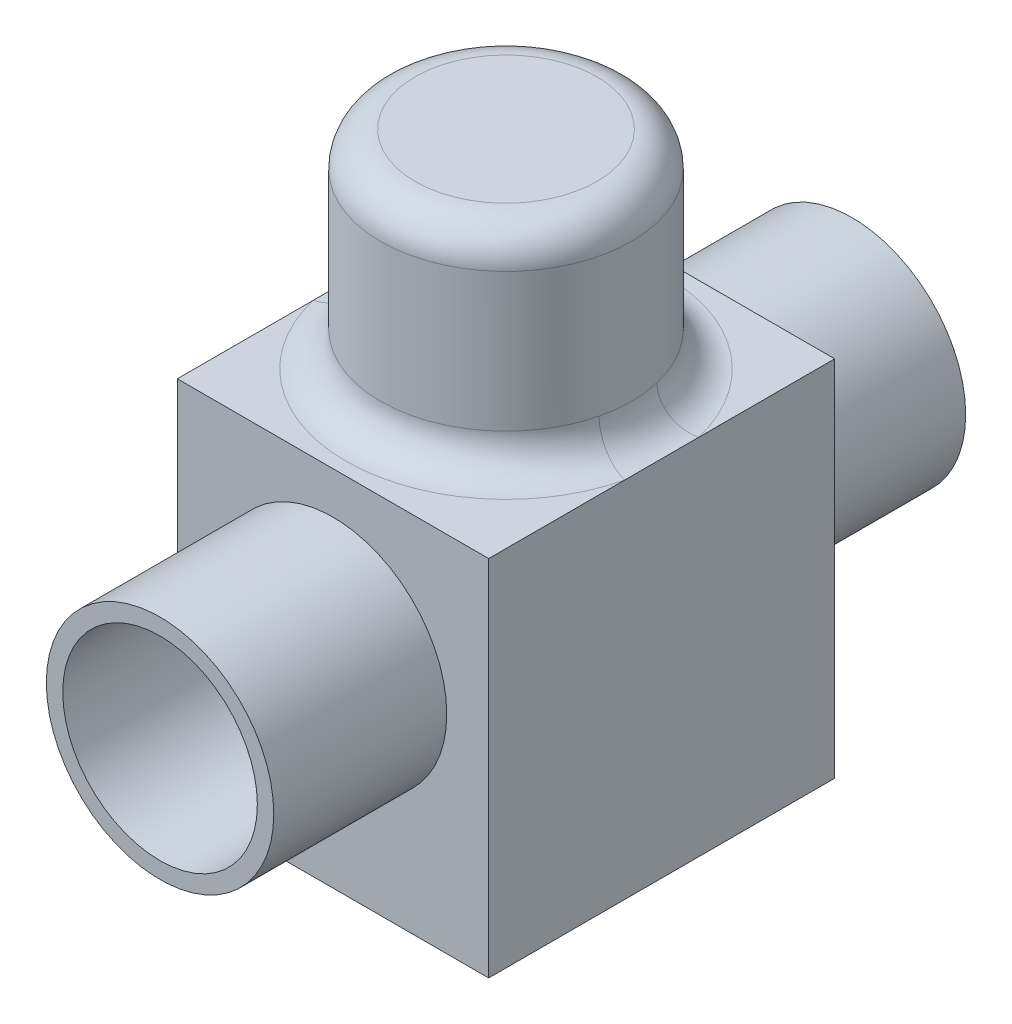
ISO-10303-21;
HEADER;
FILE_DESCRIPTION(('STEP AP214'),'2;1');
FILE_NAME('part.step','',(''),(''),'','','');
FILE_SCHEMA(('AUTOMOTIVE_DESIGN { 1 0 10303 214 1 1 1 1 }'));
ENDSEC;
DATA;
#1=APPLICATION_CONTEXT('core data for automotive mechanical design processes');
#2=APPLICATION_PROTOCOL_DEFINITION('international standard','automotive_design',2000,#1);
#3=PRODUCT_CONTEXT('',#1,'mechanical');
#4=PRODUCT('Part','Part','',(#3));
#5=PRODUCT_RELATED_PRODUCT_CATEGORY('part','',(#4));
#6=PRODUCT_DEFINITION_FORMATION('','',#4);
#7=PRODUCT_DEFINITION_CONTEXT('part definition',#1,'design');
#8=PRODUCT_DEFINITION('design','',#6,#7);
#9=PRODUCT_DEFINITION_SHAPE('','',#8);
#10=(LENGTH_UNIT() NAMED_UNIT(*) SI_UNIT(.MILLI.,.METRE.));
#11=(NAMED_UNIT(*) PLANE_ANGLE_UNIT() SI_UNIT($,.RADIAN.));
#12=(NAMED_UNIT(*) SI_UNIT($,.STERADIAN.) SOLID_ANGLE_UNIT());
#13=UNCERTAINTY_MEASURE_WITH_UNIT(LENGTH_MEASURE(1.E-05),#10,'distance_accuracy_value','');
#14=(GEOMETRIC_REPRESENTATION_CONTEXT(3) GLOBAL_UNCERTAINTY_ASSIGNED_CONTEXT((#13)) GLOBAL_UNIT_ASSIGNED_CONTEXT((#10,
#11,#12)) REPRESENTATION_CONTEXT('',''));
#15=CARTESIAN_POINT('',(0.,0.,0.));
#16=DIRECTION('',(0.,0.,1.));
#17=DIRECTION('',(1.,0.,0.));
#18=AXIS2_PLACEMENT_3D('',#15,#16,#17);
#19=CARTESIAN_POINT('',(0.,18.,0.));
#20=DIRECTION('',(0.,1.,0.));
#21=DIRECTION('',(0.,0.,1.));
#22=AXIS2_PLACEMENT_3D('',#19,#20,#21);
#23=PLANE('',#22);
#24=DIRECTION('',(0.,0.,1.));
#25=VECTOR('',#24,1.);
#26=CARTESIAN_POINT('',(-9.,18.,-10.));
#27=LINE('',#26,#25);
#28=CARTESIAN_POINT('',(-9.,18.,-10.));
#29=VERTEX_POINT('',#28);
#30=CARTESIAN_POINT('',(-9.,18.,-2.13600093632938));
#31=VERTEX_POINT('',#30);
#32=EDGE_CURVE('E117',#29,#31,#27,.T.);
#33=ORIENTED_EDGE('',*,*,#32,.T.);
#34=CARTESIAN_POINT('',(0.,18.,0.));
#35=DIRECTION('',(0.,1.,0.));
#36=DIRECTION('',(0.,0.,1.));
#37=AXIS2_PLACEMENT_3D('',#34,#35,#36);
#38=CIRCLE('',#37,9.25);
#39=CARTESIAN_POINT('',(9.,18.,-2.1360009363294));
#40=VERTEX_POINT('',#39);
#41=EDGE_CURVE('E218',#31,#40,#38,.F.);
#42=ORIENTED_EDGE('',*,*,#41,.T.);
#43=DIRECTION('',(0.,0.,-1.));
#44=VECTOR('',#43,1.);
#45=CARTESIAN_POINT('',(9.,18.,-10.));
#46=LINE('',#45,#44);
#47=CARTESIAN_POINT('',(9.,18.,-10.));
#48=VERTEX_POINT('',#47);
#49=EDGE_CURVE('E157',#40,#48,#46,.T.);
#50=ORIENTED_EDGE('',*,*,#49,.T.);
#51=DIRECTION('',(-1.,0.,0.));
#52=VECTOR('',#51,1.);
#53=CARTESIAN_POINT('',(-9.,18.,-10.));
#54=LINE('',#53,#52);
#55=EDGE_CURVE('E155',#48,#29,#54,.T.);
#56=ORIENTED_EDGE('',*,*,#55,.T.);
#57=EDGE_LOOP('',(#33,#42,#50,#56));
#58=FACE_BOUND('',#57,.T.);
#59=ADVANCED_FACE('F40',(#58),#23,.T.);
#60=CARTESIAN_POINT('',(9.,18.,-10.));
#61=DIRECTION('',(-1.,0.,0.));
#62=DIRECTION('',(0.,0.,1.));
#63=AXIS2_PLACEMENT_3D('',#60,#61,#62);
#64=PLANE('',#63);
#65=DIRECTION('',(0.,-1.,0.));
#66=VECTOR('',#65,1.);
#67=CARTESIAN_POINT('',(9.,18.,10.));
#68=LINE('',#67,#66);
#69=CARTESIAN_POINT('',(9.,18.,10.));
#70=VERTEX_POINT('',#69);
#71=CARTESIAN_POINT('',(9.,-3.,10.));
#72=VERTEX_POINT('',#71);
#73=EDGE_CURVE('E164',#70,#72,#68,.T.);
#74=ORIENTED_EDGE('',*,*,#73,.T.);
#75=DIRECTION('',(0.,0.,1.));
#76=VECTOR('',#75,1.);
#77=CARTESIAN_POINT('',(9.,-3.,10.));
#78=LINE('',#77,#76);
#79=CARTESIAN_POINT('',(9.,-3.,-10.));
#80=VERTEX_POINT('',#79);
#81=EDGE_CURVE('E130',#80,#72,#78,.T.);
#82=ORIENTED_EDGE('',*,*,#81,.F.);
#83=DIRECTION('',(0.,-1.,0.));
#84=VECTOR('',#83,1.);
#85=CARTESIAN_POINT('',(9.,18.,-10.));
#86=LINE('',#85,#84);
#87=EDGE_CURVE('E120',#48,#80,#86,.T.);
#88=ORIENTED_EDGE('',*,*,#87,.F.);
#89=ORIENTED_EDGE('',*,*,#49,.F.);
#90=CARTESIAN_POINT('',(9.,18.,2.1360009363294));
#91=VERTEX_POINT('',#90);
#92=EDGE_CURVE('E156',#91,#40,#46,.T.);
#93=ORIENTED_EDGE('',*,*,#92,.F.);
#94=EDGE_CURVE('E153',#70,#91,#46,.T.);
#95=ORIENTED_EDGE('',*,*,#94,.F.);
#96=EDGE_LOOP('',(#74,#82,#88,#89,#93,#95));
#97=FACE_BOUND('',#96,.T.);
#98=ADVANCED_FACE('F191',(#97),#64,.F.);
#99=CARTESIAN_POINT('',(-9.,18.,-10.));
#100=DIRECTION('',(0.,0.,1.));
#101=DIRECTION('',(1.,0.,0.));
#102=AXIS2_PLACEMENT_3D('',#99,#100,#101);
#103=PLANE('',#102);
#104=CARTESIAN_POINT('',(0.,9.,-10.));
#105=DIRECTION('',(0.,0.,1.));
#106=DIRECTION('',(1.,0.,0.));
#107=AXIS2_PLACEMENT_3D('',#104,#105,#106);
#108=CIRCLE('',#107,6.575);
#109=CARTESIAN_POINT('',(6.575,9.,-10.));
#110=VERTEX_POINT('',#109);
#111=EDGE_CURVE('E11',#110,#110,#108,.F.);
#112=ORIENTED_EDGE('',*,*,#111,.F.);
#113=EDGE_LOOP('',(#112));
#114=FACE_BOUND('',#113,.T.);
#115=ORIENTED_EDGE('',*,*,#87,.T.);
#116=DIRECTION('',(1.,0.,0.));
#117=VECTOR('',#116,1.);
#118=CARTESIAN_POINT('',(-9.,-3.,-10.));
#119=LINE('',#118,#117);
#120=CARTESIAN_POINT('',(-9.,-3.,-10.));
#121=VERTEX_POINT('',#120);
#122=EDGE_CURVE('E124',#121,#80,#119,.T.);
#123=ORIENTED_EDGE('',*,*,#122,.F.);
#124=DIRECTION('',(0.,-1.,0.));
#125=VECTOR('',#124,1.);
#126=CARTESIAN_POINT('',(-9.,18.,-10.));
#127=LINE('',#126,#125);
#128=EDGE_CURVE('E109',#29,#121,#127,.T.);
#129=ORIENTED_EDGE('',*,*,#128,.F.);
#130=ORIENTED_EDGE('',*,*,#55,.F.);
#131=EDGE_LOOP('',(#115,#123,#129,#130));
#132=FACE_BOUND('',#131,.T.);
#133=ADVANCED_FACE('F125',(#114,#132),#103,.F.);
#134=CARTESIAN_POINT('',(-9.,18.,-10.));
#135=DIRECTION('',(1.,0.,0.));
#136=DIRECTION('',(0.,0.,-1.));
#137=AXIS2_PLACEMENT_3D('',#134,#135,#136);
#138=PLANE('',#137);
#139=ORIENTED_EDGE('',*,*,#128,.T.);
#140=DIRECTION('',(0.,0.,-1.));
#141=VECTOR('',#140,1.);
#142=CARTESIAN_POINT('',(-9.,-3.,10.));
#143=LINE('',#142,#141);
#144=CARTESIAN_POINT('',(-9.,-3.,10.));
#145=VERTEX_POINT('',#144);
#146=EDGE_CURVE('E114',#145,#121,#143,.T.);
#147=ORIENTED_EDGE('',*,*,#146,.F.);
#148=DIRECTION('',(0.,-1.,0.));
#149=VECTOR('',#148,1.);
#150=CARTESIAN_POINT('',(-9.,18.,10.));
#151=LINE('',#150,#149);
#152=CARTESIAN_POINT('',(-9.,18.,10.));
#153=VERTEX_POINT('',#152);
#154=EDGE_CURVE('E121',#153,#145,#151,.T.);
#155=ORIENTED_EDGE('',*,*,#154,.F.);
#156=CARTESIAN_POINT('',(-9.,18.,2.13600093632938));
#157=VERTEX_POINT('',#156);
#158=EDGE_CURVE('E159',#157,#153,#27,.T.);
#159=ORIENTED_EDGE('',*,*,#158,.F.);
#160=EDGE_CURVE('E162',#31,#157,#27,.T.);
#161=ORIENTED_EDGE('',*,*,#160,.F.);
#162=ORIENTED_EDGE('',*,*,#32,.F.);
#163=EDGE_LOOP('',(#139,#147,#155,#159,#161,#162));
#164=FACE_BOUND('',#163,.T.);
#165=ADVANCED_FACE('F111',(#164),#138,.F.);
#166=CARTESIAN_POINT('',(-9.,18.,10.));
#167=DIRECTION('',(0.,0.,-1.));
#168=DIRECTION('',(-1.,0.,0.));
#169=AXIS2_PLACEMENT_3D('',#166,#167,#168);
#170=PLANE('',#169);
#171=CARTESIAN_POINT('',(0.,9.,10.));
#172=DIRECTION('',(0.,0.,-1.));
#173=DIRECTION('',(-1.,0.,0.));
#174=AXIS2_PLACEMENT_3D('',#171,#172,#173);
#175=CIRCLE('',#174,6.575);
#176=CARTESIAN_POINT('',(-6.575,9.,10.));
#177=VERTEX_POINT('',#176);
#178=EDGE_CURVE('E48',#177,#177,#175,.F.);
#179=ORIENTED_EDGE('',*,*,#178,.F.);
#180=EDGE_LOOP('',(#179));
#181=FACE_BOUND('',#180,.T.);
#182=ORIENTED_EDGE('',*,*,#154,.T.);
#183=DIRECTION('',(-1.,0.,0.));
#184=VECTOR('',#183,1.);
#185=CARTESIAN_POINT('',(-9.,-3.,10.));
#186=LINE('',#185,#184);
#187=EDGE_CURVE('E135',#72,#145,#186,.T.);
#188=ORIENTED_EDGE('',*,*,#187,.F.);
#189=ORIENTED_EDGE('',*,*,#73,.F.);
#190=DIRECTION('',(1.,0.,0.));
#191=VECTOR('',#190,1.);
#192=CARTESIAN_POINT('',(-9.,18.,10.));
#193=LINE('',#192,#191);
#194=EDGE_CURVE('E161',#153,#70,#193,.T.);
#195=ORIENTED_EDGE('',*,*,#194,.F.);
#196=EDGE_LOOP('',(#182,#188,#189,#195));
#197=FACE_BOUND('',#196,.T.);
#198=ADVANCED_FACE('F252',(#181,#197),#170,.F.);
#199=ORIENTED_EDGE('',*,*,#94,.T.);
#200=CARTESIAN_POINT('',(0.,18.,0.));
#201=DIRECTION('',(0.,1.,0.));
#202=DIRECTION('',(0.,0.,1.));
#203=AXIS2_PLACEMENT_3D('',#200,#201,#202);
#204=CIRCLE('',#203,9.25);
#205=EDGE_CURVE('E55',#91,#157,#204,.F.);
#206=ORIENTED_EDGE('',*,*,#205,.T.);
#207=ORIENTED_EDGE('',*,*,#158,.T.);
#208=ORIENTED_EDGE('',*,*,#194,.T.);
#209=EDGE_LOOP('',(#199,#206,#207,#208));
#210=FACE_BOUND('',#209,.T.);
#211=ADVANCED_FACE('F247',(#210),#23,.T.);
#212=CARTESIAN_POINT('',(0.,30.,0.));
#213=DIRECTION('',(0.,-1.,0.));
#214=DIRECTION('',(0.,0.,-1.));
#215=AXIS2_PLACEMENT_3D('',#212,#213,#214);
#216=CYLINDRICAL_SURFACE('',#215,7.25);
#217=CARTESIAN_POINT('',(0.,28.,0.));
#218=DIRECTION('',(0.,1.,0.));
#219=DIRECTION('',(0.,0.,1.));
#220=AXIS2_PLACEMENT_3D('',#217,#218,#219);
#221=CIRCLE('',#220,7.25);
#222=CARTESIAN_POINT('',(0.,28.,7.25));
#223=VERTEX_POINT('',#222);
#224=EDGE_CURVE('E224',#223,#223,#221,.F.);
#225=ORIENTED_EDGE('',*,*,#224,.T.);
#226=EDGE_LOOP('',(#225));
#227=FACE_BOUND('',#226,.T.);
#228=CARTESIAN_POINT('',(0.,20.,0.));
#229=DIRECTION('',(0.,1.,0.));
#230=DIRECTION('',(0.,0.,1.));
#231=AXIS2_PLACEMENT_3D('',#228,#229,#230);
#232=CIRCLE('',#231,7.25);
#233=CARTESIAN_POINT('',(7.05405405405405,20.,-1.67416289604196));
#234=VERTEX_POINT('',#233);
#235=CARTESIAN_POINT('',(-7.05405405405405,20.,-1.67416289604195));
#236=VERTEX_POINT('',#235);
#237=EDGE_CURVE('E171',#234,#236,#232,.T.);
#238=ORIENTED_EDGE('',*,*,#237,.T.);
#239=CARTESIAN_POINT('',(-6.86645116028137,19.985625590271,-2.32687525739361));
#240=CARTESIAN_POINT('',(-6.89425850046252,17.746165321657,-2.24481768140432));
#241=CARTESIAN_POINT('',(-9.,18.,-2.96877188012289));
#242=CARTESIAN_POINT('',(-6.89858246968315,19.9905433926965,-2.23206482691067));
#243=CARTESIAN_POINT('',(-6.91856569058457,17.7927643463919,-2.16956332755627));
#244=CARTESIAN_POINT('',(-9.,18.,-2.84780684812752));
#245=CARTESIAN_POINT('',(-6.92875640371099,19.9939202585828,-2.13655668912329));
#246=CARTESIAN_POINT('',(-6.94318607772107,17.835246476981,-2.08924134923657));
#247=CARTESIAN_POINT('',(-9.,18.,-2.72595163784708));
#248=CARTESIAN_POINT('',(-6.98512687624981,19.9983965029705,-1.94435645313844));
#249=CARTESIAN_POINT('',(-6.99113267746452,17.911730867345,-1.92203079133896));
#250=CARTESIAN_POINT('',(-9.,18.,-2.48073064710775));
#251=CARTESIAN_POINT('',(-7.01132406585655,19.9994962546678,-1.84766455156117));
#252=CARTESIAN_POINT('',(-7.0145430836226,17.9459825010371,-1.83504732530587));
#253=CARTESIAN_POINT('',(-9.,18.,-2.3573651175091));
#254=CARTESIAN_POINT('',(-7.05968412840102,20.0002236679441,-1.6532965160246));
#255=CARTESIAN_POINT('',(-7.05892145187483,18.0070917293139,-1.65604605717246));
#256=CARTESIAN_POINT('',(-9.,18.,-2.10937831354861));
#257=CARTESIAN_POINT('',(-7.08184780892583,19.9998516245451,-1.55562058322985));
#258=CARTESIAN_POINT('',(-7.07998178401766,18.0341373099389,-1.56388018794327));
#259=CARTESIAN_POINT('',(-9.,18.,-1.98475729584498));
#260=CARTESIAN_POINT('',(-7.12210983502763,19.9982785588426,-1.35944155144092));
#261=CARTESIAN_POINT('',(-7.1189374908516,18.08182579707,-1.37572175818721));
#262=CARTESIAN_POINT('',(-9.,18.,-1.73445991045912));
#263=CARTESIAN_POINT('',(-7.14020802602992,19.9970775050262,-1.26093842114339));
#264=CARTESIAN_POINT('',(-7.13691942289724,18.1026053007462,-1.27954273241777));
#265=CARTESIAN_POINT('',(-9.,18.,-1.60878350283812));
#266=CARTESIAN_POINT('',(-7.18750843257679,19.9931492039848,-0.96964831069375));
#267=CARTESIAN_POINT('',(-7.18419183845019,18.1553552731916,-0.993234066654036));
#268=CARTESIAN_POINT('',(-9.,18.,-1.23713749985064));
#269=CARTESIAN_POINT('',(-7.21099779626181,19.9900536945553,-0.775904029264924));
#270=CARTESIAN_POINT('',(-7.20889074489552,18.1802808442498,-0.796657733500563));
#271=CARTESIAN_POINT('',(-9.,18.,-0.989946520096626));
#272=CARTESIAN_POINT('',(-7.24228065774029,19.9856295004808,-0.387170314970604));
#273=CARTESIAN_POINT('',(-7.24168399407389,18.2127264261561,-0.399965445306288));
#274=CARTESIAN_POINT('',(-9.,18.,-0.493975919100428));
#275=CARTESIAN_POINT('',(-7.25007501101571,19.9843007195389,-0.192180950551583));
#276=CARTESIAN_POINT('',(-7.25008058668409,18.2205544393405,-0.198067067536435));
#277=CARTESIAN_POINT('',(-9.,18.,-0.245196385186503));
#278=CARTESIAN_POINT('',(-7.24992268964728,19.9843266279977,0.200924237368297));
#279=CARTESIAN_POINT('',(-7.249916953679,18.2204017970642,0.207087329869088));
#280=CARTESIAN_POINT('',(-9.,18.,0.256351613194035));
#281=CARTESIAN_POINT('',(-7.24172132955356,19.9857247352091,0.399040004107215));
#282=CARTESIAN_POINT('',(-7.24108016700738,18.212163306142,0.412233972620049));
#283=CARTESIAN_POINT('',(-9.,18.,0.509120005240242));
#284=CARTESIAN_POINT('',(-7.20911813215844,19.9903019258237,0.79395574222524));
#285=CARTESIAN_POINT('',(-7.20692667336215,18.178300047639,0.815021285479998));
#286=CARTESIAN_POINT('',(-9.,18.,1.01297801594255));
#287=CARTESIAN_POINT('',(-7.18471504991411,19.993481146085,0.990755611316689));
#288=CARTESIAN_POINT('',(-7.18128464609746,18.1523425097882,1.01452811982343));
#289=CARTESIAN_POINT('',(-9.,18.,1.2640675040937));
#290=CARTESIAN_POINT('',(-7.13564998587844,19.9973968695368,1.28661202037639));
#291=CARTESIAN_POINT('',(-7.13238398712575,18.0974053361203,1.30469444378519));
#292=CARTESIAN_POINT('',(-9.,18.,1.64153947427333));
#293=CARTESIAN_POINT('',(-7.11688087402826,19.9985695294366,1.38667624690682));
#294=CARTESIAN_POINT('',(-7.11379397750772,18.0757468847273,1.40214963140985));
#295=CARTESIAN_POINT('',(-9.,18.,1.76920762536388));
#296=CARTESIAN_POINT('',(-7.07514498323879,19.9999972833252,1.58593238305386));
#297=CARTESIAN_POINT('',(-7.07359017799965,18.0260170301948,1.59261024954468));
#298=CARTESIAN_POINT('',(-9.,18.,2.0234309714825));
#299=CARTESIAN_POINT('',(-7.05217838486311,20.0002524167735,1.68512433000109));
#300=CARTESIAN_POINT('',(-7.05188458261275,17.9977975867297,1.68580837649896));
#301=CARTESIAN_POINT('',(-9.,18.,2.14998621413929));
#302=CARTESIAN_POINT('',(-7.00208296764056,19.9991575610373,1.88247119569881));
#303=CARTESIAN_POINT('',(-7.00624807352815,17.9339954799349,1.86654393564639));
#304=CARTESIAN_POINT('',(-9.,18.,2.40177359451231));
#305=CARTESIAN_POINT('',(-6.97495326692717,19.9978072313588,1.98062589000923));
#306=CARTESIAN_POINT('',(-6.98222017131895,17.8982084689351,1.95423144753876));
#307=CARTESIAN_POINT('',(-9.,18.,2.52700544587397));
#308=CARTESIAN_POINT('',(-6.91659356644461,19.9926384856607,2.17568576579342));
#309=CARTESIAN_POINT('',(-6.93317650583341,17.8182499639595,2.12240745121081));
#310=CARTESIAN_POINT('',(-9.,18.,2.77587494256421));
#311=CARTESIAN_POINT('',(-6.88536280905491,19.988819613095,2.27259071274994));
#312=CARTESIAN_POINT('',(-6.90807455046277,17.7738067653839,2.20298649099486));
#313=CARTESIAN_POINT('',(-9.,18.,2.89951228868114));
#314=CARTESIAN_POINT('',(-6.85211574621099,19.9833352802333,2.36875701593207));
#315=CARTESIAN_POINT('',(-6.88343206480437,17.7250469673999,2.27816813817727));
#316=CARTESIAN_POINT('',(-9.,18.,3.02220722722367));
#317=(BOUNDED_SURFACE() B_SPLINE_SURFACE(3,2,((#239,#240,#241),(#242,#243,#244),(#245,#246,
#247),(#248,#249,#250),(#251,#252,#253),(#254,#255,#256),(#257,#258,#259),(#260,#261,#262),
(#263,#264,#265),(#266,#267,#268),(#269,#270,#271),(#272,#273,#274),(#275,#276,#277),(#278,#279,
#280),(#281,#282,#283),(#284,#285,#286),(#287,#288,#289),(#290,#291,#292),(#293,#294,#295),
(#296,#297,#298),(#299,#300,#301),(#302,#303,#304),(#305,#306,#307),(#308,#309,#310),(#311,#312,
#313),(#314,#315,#316)),.UNSPECIFIED.,.F.,.F.,.F.) B_SPLINE_SURFACE_WITH_KNOTS((4,2,2,2,2,2,2,2,
2,2,2,2,4),(3,3),(0.,0.383390236409957,0.766717634077136,1.14996819749077,1.53323333007679,
2.27941320488612,3.025552406852,3.78366873441023,4.54184332249184,4.93144597002859,
5.32103186194167,5.7107003937235,6.10044101358401),(0.,1.),
.UNSPECIFIED.) GEOMETRIC_REPRESENTATION_ITEM() RATIONAL_B_SPLINE_SURFACE(((1.,0.665827919281929,
1.),(1.,0.672917521013643,1.),(1.,0.679565020911603,1.),(1.,0.691969267183414,1.),(1.,
0.697726159375705,1.),(1.,0.708343903775857,1.),(1.,0.713204935354938,1.),(1.,0.722029193813538,
1.),(1.,0.725992386556215,1.),(1.,0.736345275389174,1.),(1.,0.741479138072754,1.),(1.,
0.748314595731294,1.),(1.,0.750016377777375,1.),(1.,0.749983120131789,1.),(1.,0.748192473621187,
1.),(1.,0.741068315278983,1.),(1.,0.735734531192103,1.),(1.,0.724994357143825,1.),(1.,
0.720883759271795,1.),(1.,0.711735067071159,1.),(1.,0.706697012638954,1.),(1.,0.695695742217173,
1.),(1.,0.68973233020686,1.),(1.,0.676886117100211,1.),(1.,0.670003146122404,1.),(1.,
0.662663999506444,1.))) REPRESENTATION_ITEM('') SURFACE());
#318=CARTESIAN_POINT('',(-6.86645116028137,19.985625590271,-2.32687525739361));
#319=CARTESIAN_POINT('',(-6.89858246968315,19.9905433926965,-2.23206482691067));
#320=CARTESIAN_POINT('',(-6.92875640371099,19.9939202585828,-2.13655668912329));
#321=CARTESIAN_POINT('',(-6.9851268762498,19.9983965029705,-1.94435645313844));
#322=CARTESIAN_POINT('',(-7.01132406585655,19.9994962546678,-1.84766455156117));
#323=CARTESIAN_POINT('',(-7.05968412840102,20.0002236679441,-1.6532965160246));
#324=CARTESIAN_POINT('',(-7.08184780892583,19.9998516245451,-1.55562058322985));
#325=CARTESIAN_POINT('',(-7.12210983502763,19.9982785588426,-1.35944155144092));
#326=CARTESIAN_POINT('',(-7.14020802602992,19.9970775050262,-1.26093842114339));
#327=CARTESIAN_POINT('',(-7.18750843257678,19.9931492039848,-0.96964831069375));
#328=CARTESIAN_POINT('',(-7.21099779626181,19.9900536945553,-0.775904029264924));
#329=CARTESIAN_POINT('',(-7.24228065774029,19.9856295004808,-0.387170314970604));
#330=CARTESIAN_POINT('',(-7.25007501101571,19.9843007195389,-0.192180950551583));
#331=CARTESIAN_POINT('',(-7.24992268964728,19.9843266279977,0.200924237368297));
#332=CARTESIAN_POINT('',(-7.24172132955356,19.9857247352091,0.399040004107215));
#333=CARTESIAN_POINT('',(-7.20911813215844,19.9903019258237,0.79395574222524));
#334=CARTESIAN_POINT('',(-7.18471504991411,19.993481146085,0.990755611316688));
#335=CARTESIAN_POINT('',(-7.13564998587844,19.9973968695368,1.28661202037639));
#336=CARTESIAN_POINT('',(-7.11688087402826,19.9985695294366,1.38667624690682));
#337=CARTESIAN_POINT('',(-7.07514498323879,19.9999972833252,1.58593238305386));
#338=CARTESIAN_POINT('',(-7.05217838486311,20.0002524167735,1.68512433000109));
#339=CARTESIAN_POINT('',(-7.00208296764056,19.9991575610373,1.88247119569881));
#340=CARTESIAN_POINT('',(-6.97495326692717,19.9978072313588,1.98062589000923));
#341=CARTESIAN_POINT('',(-6.91659356644461,19.9926384856607,2.17568576579342));
#342=CARTESIAN_POINT('',(-6.88536280905491,19.988819613095,2.27259071274994));
#343=CARTESIAN_POINT('',(-6.85211574621099,19.9833352802333,2.36875701593207));
#344=B_SPLINE_CURVE_WITH_KNOTS('',3,(#318,#319,#320,#321,#322,#323,#324,#325,#326,#327,#328,
#329,#330,#331,#332,#333,#334,#335,#336,#337,#338,#339,#340,#341,#342,#343),.UNSPECIFIED.,.F.,
.F.,(4,2,2,2,2,2,2,2,2,2,2,2,4),(0.,0.383390236409957,0.766717634077136,1.14996819749077,
1.53323333007679,2.27941320488612,3.025552406852,3.78366873441023,4.54184332249184,
4.93144597002859,5.32103186194167,5.7107003937235,6.10044101358401),.UNSPECIFIED.);
#345=CARTESIAN_POINT('',(-7.05405405405405,20.,1.67416289604195));
#346=VERTEX_POINT('',#345);
#347=EDGE_CURVE('E286',#236,#346,#344,.T.);
#348=ORIENTED_EDGE('',*,*,#347,.T.);
#349=CARTESIAN_POINT('',(0.,20.,0.));
#350=DIRECTION('',(0.,1.,0.));
#351=DIRECTION('',(0.,0.,1.));
#352=AXIS2_PLACEMENT_3D('',#349,#350,#351);
#353=CIRCLE('',#352,7.25);
#354=CARTESIAN_POINT('',(7.05405405405405,20.,1.67416289604196));
#355=VERTEX_POINT('',#354);
#356=EDGE_CURVE('E181',#346,#355,#353,.T.);
#357=ORIENTED_EDGE('',*,*,#356,.T.);
#358=CARTESIAN_POINT('',(6.86645116028137,19.985625590271,2.32687525739362));
#359=CARTESIAN_POINT('',(6.89425850046252,17.746165321657,2.24481768140433));
#360=CARTESIAN_POINT('',(9.,18.,2.9687718801229));
#361=CARTESIAN_POINT('',(6.89858246968315,19.9905433926965,2.23206482691068));
#362=CARTESIAN_POINT('',(6.91856569058457,17.7927643463919,2.16956332755627));
#363=CARTESIAN_POINT('',(9.,18.,2.84780684812753));
#364=CARTESIAN_POINT('',(6.92875640371099,19.9939202585828,2.1365566891233));
#365=CARTESIAN_POINT('',(6.94318607772107,17.835246476981,2.08924134923658));
#366=CARTESIAN_POINT('',(9.,18.,2.72595163784709));
#367=CARTESIAN_POINT('',(6.9851268762498,19.9983965029705,1.94435645313845));
#368=CARTESIAN_POINT('',(6.99113267746451,17.911730867345,1.92203079133897));
#369=CARTESIAN_POINT('',(9.,18.,2.48073064710776));
#370=CARTESIAN_POINT('',(7.01132406585654,19.9994962546678,1.84766455156118));
#371=CARTESIAN_POINT('',(7.0145430836226,17.9459825010371,1.83504732530588));
#372=CARTESIAN_POINT('',(9.,18.,2.35736511750911));
#373=CARTESIAN_POINT('',(7.05968412840102,20.0002236679441,1.65329651602461));
#374=CARTESIAN_POINT('',(7.05892145187483,18.0070917293139,1.65604605717247));
#375=CARTESIAN_POINT('',(9.,18.,2.10937831354862));
#376=CARTESIAN_POINT('',(7.08184780892583,19.9998516245451,1.55562058322986));
#377=CARTESIAN_POINT('',(7.07998178401766,18.0341373099389,1.56388018794327));
#378=CARTESIAN_POINT('',(9.,18.,1.98475729584499));
#379=CARTESIAN_POINT('',(7.12210983502763,19.9982785588426,1.35944155144093));
#380=CARTESIAN_POINT('',(7.1189374908516,18.08182579707,1.37572175818722));
#381=CARTESIAN_POINT('',(9.,18.,1.73445991045913));
#382=CARTESIAN_POINT('',(7.14020802602992,19.9970775050262,1.26093842114339));
#383=CARTESIAN_POINT('',(7.13691942289724,18.1026053007462,1.27954273241778));
#384=CARTESIAN_POINT('',(9.,18.,1.60878350283813));
#385=CARTESIAN_POINT('',(7.18750843257679,19.9931492039848,0.969648310693758));
#386=CARTESIAN_POINT('',(7.18419183845019,18.1553552731916,0.993234066654045));
#387=CARTESIAN_POINT('',(9.,18.,1.23713749985065));
#388=CARTESIAN_POINT('',(7.21099779626181,19.9900536945553,0.775904029264932));
#389=CARTESIAN_POINT('',(7.20889074489552,18.1802808442498,0.796657733500571));
#390=CARTESIAN_POINT('',(9.,18.,0.989946520096637));
#391=CARTESIAN_POINT('',(7.24228065774029,19.9856295004808,0.387170314970613));
#392=CARTESIAN_POINT('',(7.24168399407389,18.2127264261561,0.399965445306297));
#393=CARTESIAN_POINT('',(9.,18.,0.493975919100438));
#394=CARTESIAN_POINT('',(7.25007501101571,19.9843007195389,0.192180950551592));
#395=CARTESIAN_POINT('',(7.25008058668409,18.2205544393405,0.198067067536444));
#396=CARTESIAN_POINT('',(9.,18.,0.245196385186514));
#397=CARTESIAN_POINT('',(7.24992268964728,19.9843266279977,-0.200924237368288));
#398=CARTESIAN_POINT('',(7.249916953679,18.2204017970642,-0.207087329869078));
#399=CARTESIAN_POINT('',(9.,18.,-0.256351613194023));
#400=CARTESIAN_POINT('',(7.24172132955356,19.9857247352091,-0.399040004107206));
#401=CARTESIAN_POINT('',(7.24108016700739,18.212163306142,-0.41223397262004));
#402=CARTESIAN_POINT('',(9.,18.,-0.50912000524023));
#403=CARTESIAN_POINT('',(7.20911813215844,19.9903019258237,-0.793955742225231));
#404=CARTESIAN_POINT('',(7.20692667336215,18.178300047639,-0.815021285479989));
#405=CARTESIAN_POINT('',(9.,18.,-1.01297801594253));
#406=CARTESIAN_POINT('',(7.18471504991412,19.993481146085,-0.99075561131668));
#407=CARTESIAN_POINT('',(7.18128464609746,18.1523425097882,-1.01452811982342));
#408=CARTESIAN_POINT('',(9.,18.,-1.26406750409369));
#409=CARTESIAN_POINT('',(7.13564998587844,19.9973968695368,-1.28661202037638));
#410=CARTESIAN_POINT('',(7.13238398712575,18.0974053361204,-1.30469444378518));
#411=CARTESIAN_POINT('',(9.,18.,-1.64153947427332));
#412=CARTESIAN_POINT('',(7.11688087402826,19.9985695294366,-1.38667624690681));
#413=CARTESIAN_POINT('',(7.11379397750772,18.0757468847273,-1.40214963140984));
#414=CARTESIAN_POINT('',(9.,18.,-1.76920762536387));
#415=CARTESIAN_POINT('',(7.07514498323879,19.9999972833252,-1.58593238305385));
#416=CARTESIAN_POINT('',(7.07359017799965,18.0260170301948,-1.59261024954467));
#417=CARTESIAN_POINT('',(9.,18.,-2.02343097148249));
#418=CARTESIAN_POINT('',(7.05217838486311,20.0002524167735,-1.68512433000108));
#419=CARTESIAN_POINT('',(7.05188458261275,17.9977975867297,-1.68580837649895));
#420=CARTESIAN_POINT('',(9.,18.,-2.14998621413928));
#421=CARTESIAN_POINT('',(7.00208296764056,19.9991575610373,-1.88247119569881));
#422=CARTESIAN_POINT('',(7.00624807352815,17.9339954799349,-1.86654393564639));
#423=CARTESIAN_POINT('',(9.,18.,-2.4017735945123));
#424=CARTESIAN_POINT('',(6.97495326692718,19.9978072313588,-1.98062589000923));
#425=CARTESIAN_POINT('',(6.98222017131896,17.8982084689352,-1.95423144753875));
#426=CARTESIAN_POINT('',(9.,18.,-2.52700544587396));
#427=CARTESIAN_POINT('',(6.91659356644461,19.9926384856607,-2.17568576579341));
#428=CARTESIAN_POINT('',(6.93317650583342,17.8182499639595,-2.1224074512108));
#429=CARTESIAN_POINT('',(9.,18.,-2.7758749425642));
#430=CARTESIAN_POINT('',(6.88536280905491,19.988819613095,-2.27259071274994));
#431=CARTESIAN_POINT('',(6.90807455046277,17.7738067653839,-2.20298649099486));
#432=CARTESIAN_POINT('',(9.,18.,-2.89951228868113));
#433=CARTESIAN_POINT('',(6.85211574621099,19.9833352802333,-2.36875701593206));
#434=CARTESIAN_POINT('',(6.88343206480438,17.7250469673999,-2.27816813817727));
#435=CARTESIAN_POINT('',(9.,18.,-3.02220722722366));
#436=(BOUNDED_SURFACE() B_SPLINE_SURFACE(3,2,((#358,#359,#360),(#361,#362,#363),(#364,#365,
#366),(#367,#368,#369),(#370,#371,#372),(#373,#374,#375),(#376,#377,#378),(#379,#380,#381),
(#382,#383,#384),(#385,#386,#387),(#388,#389,#390),(#391,#392,#393),(#394,#395,#396),(#397,#398,
#399),(#400,#401,#402),(#403,#404,#405),(#406,#407,#408),(#409,#410,#411),(#412,#413,#414),
(#415,#416,#417),(#418,#419,#420),(#421,#422,#423),(#424,#425,#426),(#427,#428,#429),(#430,#431,
#432),(#433,#434,#435)),.UNSPECIFIED.,.F.,.F.,.F.) B_SPLINE_SURFACE_WITH_KNOTS((4,2,2,2,2,2,2,2,
2,2,2,2,4),(3,3),(0.,0.383390236409957,0.766717634077137,1.14996819749077,1.53323333007679,
2.27941320488612,3.025552406852,3.78366873441022,4.54184332249184,4.93144597002858,
5.32103186194167,5.7107003937235,6.10044101358401),(0.,1.),
.UNSPECIFIED.) GEOMETRIC_REPRESENTATION_ITEM() RATIONAL_B_SPLINE_SURFACE(((1.,0.665827919281929,
1.),(1.,0.672917521013643,1.),(1.,0.679565020911603,1.),(1.,0.691969267183414,1.),(1.,
0.697726159375705,1.),(1.,0.708343903775857,1.),(1.,0.713204935354938,1.),(1.,0.722029193813538,
1.),(1.,0.725992386556215,1.),(1.,0.736345275389175,1.),(1.,0.741479138072754,1.),(1.,
0.748314595731294,1.),(1.,0.750016377777375,1.),(1.,0.749983120131789,1.),(1.,0.748192473621187,
1.),(1.,0.741068315278983,1.),(1.,0.735734531192104,1.),(1.,0.724994357143826,1.),(1.,
0.720883759271796,1.),(1.,0.71173506707116,1.),(1.,0.706697012638955,1.),(1.,0.695695742217174,
1.),(1.,0.689732330206861,1.),(1.,0.676886117100212,1.),(1.,0.670003146122405,1.),(1.,
0.662663999506445,1.))) REPRESENTATION_ITEM('') SURFACE());
#437=CARTESIAN_POINT('',(6.86645116028137,19.985625590271,2.32687525739362));
#438=CARTESIAN_POINT('',(6.89858246968314,19.9905433926965,2.23206482691068));
#439=CARTESIAN_POINT('',(6.92875640371099,19.9939202585828,2.1365566891233));
#440=CARTESIAN_POINT('',(6.9851268762498,19.9983965029705,1.94435645313845));
#441=CARTESIAN_POINT('',(7.01132406585654,19.9994962546678,1.84766455156118));
#442=CARTESIAN_POINT('',(7.05968412840102,20.0002236679441,1.65329651602461));
#443=CARTESIAN_POINT('',(7.08184780892583,19.9998516245451,1.55562058322986));
#444=CARTESIAN_POINT('',(7.12210983502763,19.9982785588426,1.35944155144093));
#445=CARTESIAN_POINT('',(7.14020802602992,19.9970775050262,1.26093842114339));
#446=CARTESIAN_POINT('',(7.18750843257679,19.9931492039848,0.969648310693758));
#447=CARTESIAN_POINT('',(7.21099779626181,19.9900536945553,0.775904029264933));
#448=CARTESIAN_POINT('',(7.24228065774029,19.9856295004808,0.387170314970613));
#449=CARTESIAN_POINT('',(7.25007501101571,19.9843007195389,0.192180950551592));
#450=CARTESIAN_POINT('',(7.24992268964728,19.9843266279977,-0.200924237368288));
#451=CARTESIAN_POINT('',(7.24172132955356,19.9857247352091,-0.399040004107206));
#452=CARTESIAN_POINT('',(7.20911813215844,19.9903019258237,-0.793955742225231));
#453=CARTESIAN_POINT('',(7.18471504991412,19.993481146085,-0.990755611316679));
#454=CARTESIAN_POINT('',(7.13564998587844,19.9973968695368,-1.28661202037638));
#455=CARTESIAN_POINT('',(7.11688087402826,19.9985695294366,-1.38667624690681));
#456=CARTESIAN_POINT('',(7.07514498323879,19.9999972833252,-1.58593238305385));
#457=CARTESIAN_POINT('',(7.05217838486311,20.0002524167735,-1.68512433000108));
#458=CARTESIAN_POINT('',(7.00208296764056,19.9991575610373,-1.88247119569881));
#459=CARTESIAN_POINT('',(6.97495326692718,19.9978072313588,-1.98062589000923));
#460=CARTESIAN_POINT('',(6.91659356644461,19.9926384856607,-2.17568576579341));
#461=CARTESIAN_POINT('',(6.88536280905491,19.988819613095,-2.27259071274994));
#462=CARTESIAN_POINT('',(6.85211574621099,19.9833352802333,-2.36875701593206));
#463=B_SPLINE_CURVE_WITH_KNOTS('',3,(#437,#438,#439,#440,#441,#442,#443,#444,#445,#446,#447,
#448,#449,#450,#451,#452,#453,#454,#455,#456,#457,#458,#459,#460,#461,#462),.UNSPECIFIED.,.F.,
.F.,(4,2,2,2,2,2,2,2,2,2,2,2,4),(0.,0.383390236409957,0.766717634077137,1.14996819749077,
1.53323333007679,2.27941320488612,3.025552406852,3.78366873441022,4.54184332249184,
4.93144597002858,5.32103186194167,5.7107003937235,6.10044101358401),.UNSPECIFIED.);
#464=EDGE_CURVE('E173',#355,#234,#463,.T.);
#465=ORIENTED_EDGE('',*,*,#464,.T.);
#466=EDGE_LOOP('',(#238,#348,#357,#465));
#467=FACE_BOUND('',#466,.T.);
#468=ADVANCED_FACE('F183',(#227,#467),#216,.T.);
#469=CARTESIAN_POINT('',(0.,30.,0.));
#470=DIRECTION('',(0.,1.,0.));
#471=DIRECTION('',(0.,0.,1.));
#472=AXIS2_PLACEMENT_3D('',#469,#470,#471);
#473=PLANE('',#472);
#474=CARTESIAN_POINT('',(0.,30.,0.));
#475=DIRECTION('',(0.,1.,0.));
#476=DIRECTION('',(0.,0.,1.));
#477=AXIS2_PLACEMENT_3D('',#474,#475,#476);
#478=CIRCLE('',#477,5.25);
#479=CARTESIAN_POINT('',(0.,30.,5.25));
#480=VERTEX_POINT('',#479);
#481=EDGE_CURVE('E168',#480,#480,#478,.T.);
#482=ORIENTED_EDGE('',*,*,#481,.T.);
#483=EDGE_LOOP('',(#482));
#484=FACE_BOUND('',#483,.T.);
#485=ADVANCED_FACE('F268',(#484),#473,.T.);
#486=CARTESIAN_POINT('',(0.,28.,0.));
#487=DIRECTION('',(0.,1.,0.));
#488=DIRECTION('',(0.,0.,1.));
#489=AXIS2_PLACEMENT_3D('',#486,#487,#488);
#490=TOROIDAL_SURFACE('',#489,5.25,2.);
#491=ORIENTED_EDGE('',*,*,#224,.F.);
#492=EDGE_LOOP('',(#491));
#493=FACE_BOUND('',#492,.T.);
#494=ORIENTED_EDGE('',*,*,#481,.F.);
#495=EDGE_LOOP('',(#494));
#496=FACE_BOUND('',#495,.T.);
#497=ADVANCED_FACE('F204',(#493,#496),#490,.T.);
#498=CARTESIAN_POINT('',(9.,20.,2.1360009363294));
#499=DIRECTION('',(-0.230919020143719,0.,0.972972972972973));
#500=DIRECTION('',(0.972972972972973,0.,0.230919020143719));
#501=AXIS2_PLACEMENT_3D('',#498,#499,#500);
#502=CIRCLE('',#501,2.);
#503=EDGE_CURVE('E230',#91,#355,#502,.F.);
#504=ORIENTED_EDGE('',*,*,#503,.F.);
#505=ORIENTED_EDGE('',*,*,#92,.T.);
#506=CARTESIAN_POINT('',(9.,20.,-2.13600093632939));
#507=DIRECTION('',(0.230919020143718,0.,0.972972972972973));
#508=DIRECTION('',(0.972972972972973,0.,-0.230919020143718));
#509=AXIS2_PLACEMENT_3D('',#506,#507,#508);
#510=CIRCLE('',#509,2.);
#511=EDGE_CURVE('E282',#234,#40,#510,.T.);
#512=ORIENTED_EDGE('',*,*,#511,.F.);
#513=ORIENTED_EDGE('',*,*,#464,.F.);
#514=EDGE_LOOP('',(#504,#505,#512,#513));
#515=FACE_BOUND('',#514,.T.);
#516=ADVANCED_FACE('F197',(#515),#436,.F.);
#517=CARTESIAN_POINT('',(0.,20.,0.));
#518=DIRECTION('',(0.,1.,0.));
#519=DIRECTION('',(0.,0.,1.));
#520=AXIS2_PLACEMENT_3D('',#517,#518,#519);
#521=TOROIDAL_SURFACE('',#520,9.25,2.);
#522=ORIENTED_EDGE('',*,*,#511,.T.);
#523=ORIENTED_EDGE('',*,*,#41,.F.);
#524=CARTESIAN_POINT('',(-9.,20.,-2.13600093632938));
#525=DIRECTION('',(0.230919020143717,0.,-0.972972972972973));
#526=DIRECTION('',(-0.972972972972973,0.,-0.230919020143717));
#527=AXIS2_PLACEMENT_3D('',#524,#525,#526);
#528=CIRCLE('',#527,2.);
#529=EDGE_CURVE('E63',#236,#31,#528,.T.);
#530=ORIENTED_EDGE('',*,*,#529,.F.);
#531=ORIENTED_EDGE('',*,*,#237,.F.);
#532=EDGE_LOOP('',(#522,#523,#530,#531));
#533=FACE_BOUND('',#532,.T.);
#534=ADVANCED_FACE('F203',(#533),#521,.F.);
#535=CARTESIAN_POINT('',(0.,20.,0.));
#536=DIRECTION('',(0.,1.,0.));
#537=DIRECTION('',(0.,0.,1.));
#538=AXIS2_PLACEMENT_3D('',#535,#536,#537);
#539=TOROIDAL_SURFACE('',#538,9.25,2.);
#540=ORIENTED_EDGE('',*,*,#503,.T.);
#541=ORIENTED_EDGE('',*,*,#356,.F.);
#542=CARTESIAN_POINT('',(-9.,20.,2.13600093632938));
#543=DIRECTION('',(0.230919020143717,0.,0.972972972972973));
#544=DIRECTION('',(0.972972972972973,0.,-0.230919020143717));
#545=AXIS2_PLACEMENT_3D('',#542,#543,#544);
#546=CIRCLE('',#545,2.);
#547=EDGE_CURVE('E152',#157,#346,#546,.T.);
#548=ORIENTED_EDGE('',*,*,#547,.F.);
#549=ORIENTED_EDGE('',*,*,#205,.F.);
#550=EDGE_LOOP('',(#540,#541,#548,#549));
#551=FACE_BOUND('',#550,.T.);
#552=ADVANCED_FACE('F284',(#551),#539,.F.);
#553=ORIENTED_EDGE('',*,*,#529,.T.);
#554=ORIENTED_EDGE('',*,*,#160,.T.);
#555=ORIENTED_EDGE('',*,*,#547,.T.);
#556=ORIENTED_EDGE('',*,*,#347,.F.);
#557=EDGE_LOOP('',(#553,#554,#555,#556));
#558=FACE_BOUND('',#557,.T.);
#559=ADVANCED_FACE('F244',(#558),#317,.F.);
#560=CARTESIAN_POINT('',(0.,9.,20.));
#561=DIRECTION('',(0.,0.,1.));
#562=DIRECTION('',(1.,0.,0.));
#563=AXIS2_PLACEMENT_3D('',#560,#561,#562);
#564=PLANE('',#563);
#565=CARTESIAN_POINT('',(0.,9.,20.));
#566=DIRECTION('',(0.,0.,1.));
#567=DIRECTION('',(1.,0.,0.));
#568=AXIS2_PLACEMENT_3D('',#565,#566,#567);
#569=CIRCLE('',#568,6.575);
#570=CARTESIAN_POINT('',(6.575,9.,20.));
#571=VERTEX_POINT('',#570);
#572=EDGE_CURVE('E149',#571,#571,#569,.T.);
#573=ORIENTED_EDGE('',*,*,#572,.T.);
#574=EDGE_LOOP('',(#573));
#575=FACE_BOUND('',#574,.T.);
#576=CARTESIAN_POINT('',(0.,9.,20.));
#577=DIRECTION('',(0.,0.,1.));
#578=DIRECTION('',(1.,0.,0.));
#579=AXIS2_PLACEMENT_3D('',#576,#577,#578);
#580=CIRCLE('',#579,5.625);
#581=CARTESIAN_POINT('',(5.625,9.,20.));
#582=VERTEX_POINT('',#581);
#583=EDGE_CURVE('E146',#582,#582,#580,.T.);
#584=ORIENTED_EDGE('',*,*,#583,.F.);
#585=EDGE_LOOP('',(#584));
#586=FACE_BOUND('',#585,.T.);
#587=ADVANCED_FACE('F310',(#575,#586),#564,.T.);
#588=CARTESIAN_POINT('',(0.,9.,20.));
#589=DIRECTION('',(0.,0.,-1.));
#590=DIRECTION('',(-1.,0.,0.));
#591=AXIS2_PLACEMENT_3D('',#588,#589,#590);
#592=CYLINDRICAL_SURFACE('',#591,6.575);
#593=ORIENTED_EDGE('',*,*,#572,.F.);
#594=EDGE_LOOP('',(#593));
#595=FACE_BOUND('',#594,.T.);
#596=ORIENTED_EDGE('',*,*,#178,.T.);
#597=EDGE_LOOP('',(#596));
#598=FACE_BOUND('',#597,.T.);
#599=ADVANCED_FACE('F306',(#595,#598),#592,.T.);
#600=CARTESIAN_POINT('',(0.,9.,20.));
#601=DIRECTION('',(0.,0.,-1.));
#602=DIRECTION('',(-1.,0.,0.));
#603=AXIS2_PLACEMENT_3D('',#600,#601,#602);
#604=CYLINDRICAL_SURFACE('',#603,5.625);
#605=ORIENTED_EDGE('',*,*,#583,.T.);
#606=EDGE_LOOP('',(#605));
#607=FACE_BOUND('',#606,.T.);
#608=CARTESIAN_POINT('',(0.,9.,-20.));
#609=DIRECTION('',(0.,0.,-1.));
#610=DIRECTION('',(-1.,0.,0.));
#611=AXIS2_PLACEMENT_3D('',#608,#609,#610);
#612=CIRCLE('',#611,5.625);
#613=CARTESIAN_POINT('',(-5.625,9.,-20.));
#614=VERTEX_POINT('',#613);
#615=EDGE_CURVE('E140',#614,#614,#612,.T.);
#616=ORIENTED_EDGE('',*,*,#615,.T.);
#617=EDGE_LOOP('',(#616));
#618=FACE_BOUND('',#617,.T.);
#619=ADVANCED_FACE('F309',(#607,#618),#604,.F.);
#620=CARTESIAN_POINT('',(0.,9.,-20.));
#621=DIRECTION('',(0.,0.,-1.));
#622=DIRECTION('',(-1.,0.,0.));
#623=AXIS2_PLACEMENT_3D('',#620,#621,#622);
#624=PLANE('',#623);
#625=CARTESIAN_POINT('',(0.,9.,-20.));
#626=DIRECTION('',(0.,0.,-1.));
#627=DIRECTION('',(-1.,0.,0.));
#628=AXIS2_PLACEMENT_3D('',#625,#626,#627);
#629=CIRCLE('',#628,6.575);
#630=CARTESIAN_POINT('',(-6.575,9.,-20.));
#631=VERTEX_POINT('',#630);
#632=EDGE_CURVE('E143',#631,#631,#629,.T.);
#633=ORIENTED_EDGE('',*,*,#632,.T.);
#634=EDGE_LOOP('',(#633));
#635=FACE_BOUND('',#634,.T.);
#636=ORIENTED_EDGE('',*,*,#615,.F.);
#637=EDGE_LOOP('',(#636));
#638=FACE_BOUND('',#637,.T.);
#639=ADVANCED_FACE('F317',(#635,#638),#624,.T.);
#640=CARTESIAN_POINT('',(0.,9.,-20.));
#641=DIRECTION('',(0.,0.,1.));
#642=DIRECTION('',(1.,0.,0.));
#643=AXIS2_PLACEMENT_3D('',#640,#641,#642);
#644=CYLINDRICAL_SURFACE('',#643,6.575);
#645=ORIENTED_EDGE('',*,*,#632,.F.);
#646=EDGE_LOOP('',(#645));
#647=FACE_BOUND('',#646,.T.);
#648=ORIENTED_EDGE('',*,*,#111,.T.);
#649=EDGE_LOOP('',(#648));
#650=FACE_BOUND('',#649,.T.);
#651=ADVANCED_FACE('F319',(#647,#650),#644,.T.);
#652=CARTESIAN_POINT('',(0.,-3.,0.));
#653=DIRECTION('',(0.,-1.,0.));
#654=DIRECTION('',(0.,0.,-1.));
#655=AXIS2_PLACEMENT_3D('',#652,#653,#654);
#656=PLANE('',#655);
#657=ORIENTED_EDGE('',*,*,#146,.T.);
#658=ORIENTED_EDGE('',*,*,#122,.T.);
#659=ORIENTED_EDGE('',*,*,#81,.T.);
#660=ORIENTED_EDGE('',*,*,#187,.T.);
#661=EDGE_LOOP('',(#657,#658,#659,#660));
#662=FACE_BOUND('',#661,.T.);
#663=ADVANCED_FACE('F133',(#662),#656,.T.);
#664=CLOSED_SHELL('',(#59,#98,#133,#165,#198,#211,#468,#485,#497,#516,#534,#552,#559,#587,#599,
#619,#639,#651,#663));
#665=MANIFOLD_SOLID_BREP('B2',#664);
#666=ADVANCED_BREP_SHAPE_REPRESENTATION('',(#18,#665),#14);
#667=SHAPE_DEFINITION_REPRESENTATION(#9,#666);
ENDSEC;
END-ISO-10303-21;
